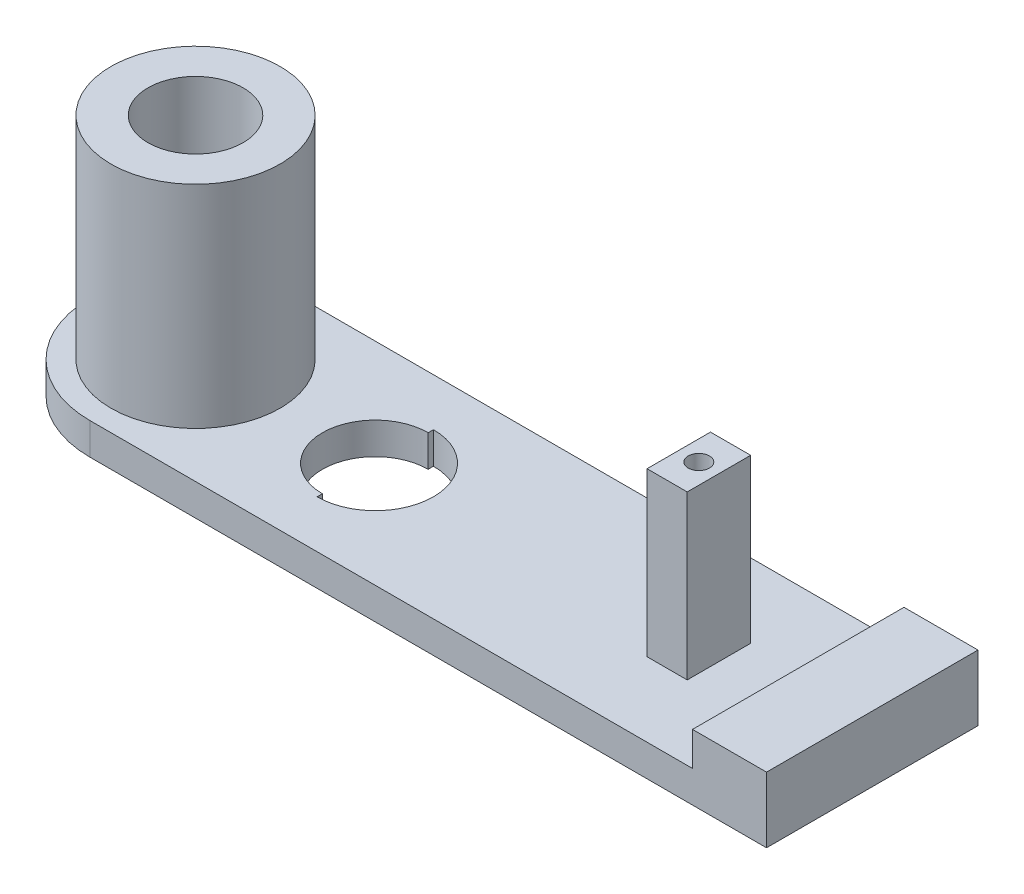
ISO-10303-21;
HEADER;
FILE_DESCRIPTION(('STEP AP214'),'2;1');
FILE_NAME('part.step','',(''),(''),'','','');
FILE_SCHEMA(('AUTOMOTIVE_DESIGN { 1 0 10303 214 1 1 1 1 }'));
ENDSEC;
DATA;
#1=APPLICATION_CONTEXT('core data for automotive mechanical design processes');
#2=APPLICATION_PROTOCOL_DEFINITION('international standard','automotive_design',2000,#1);
#3=PRODUCT_CONTEXT('',#1,'mechanical');
#4=PRODUCT('Part','Part','',(#3));
#5=PRODUCT_RELATED_PRODUCT_CATEGORY('part','',(#4));
#6=PRODUCT_DEFINITION_FORMATION('','',#4);
#7=PRODUCT_DEFINITION_CONTEXT('part definition',#1,'design');
#8=PRODUCT_DEFINITION('design','',#6,#7);
#9=PRODUCT_DEFINITION_SHAPE('','',#8);
#10=(LENGTH_UNIT() NAMED_UNIT(*) SI_UNIT(.MILLI.,.METRE.));
#11=(NAMED_UNIT(*) PLANE_ANGLE_UNIT() SI_UNIT($,.RADIAN.));
#12=(NAMED_UNIT(*) SI_UNIT($,.STERADIAN.) SOLID_ANGLE_UNIT());
#13=UNCERTAINTY_MEASURE_WITH_UNIT(LENGTH_MEASURE(1.E-05),#10,'distance_accuracy_value','');
#14=(GEOMETRIC_REPRESENTATION_CONTEXT(3) GLOBAL_UNCERTAINTY_ASSIGNED_CONTEXT((#13)) GLOBAL_UNIT_ASSIGNED_CONTEXT((#10,
#11,#12)) REPRESENTATION_CONTEXT('',''));
#15=CARTESIAN_POINT('',(0.,0.,0.));
#16=DIRECTION('',(0.,0.,1.));
#17=DIRECTION('',(1.,0.,0.));
#18=AXIS2_PLACEMENT_3D('',#15,#16,#17);
#19=CARTESIAN_POINT('',(-160.,15.,0.));
#20=DIRECTION('',(0.,1.,0.));
#21=DIRECTION('',(0.,0.,1.));
#22=AXIS2_PLACEMENT_3D('',#19,#20,#21);
#23=PLANE('',#22);
#24=CARTESIAN_POINT('',(-75.,15.,0.));
#25=DIRECTION('',(0.,1.,0.));
#26=DIRECTION('',(0.,0.,1.));
#27=AXIS2_PLACEMENT_3D('',#24,#25,#26);
#28=CIRCLE('',#27,27.5);
#29=CARTESIAN_POINT('',(-75.,15.,27.5));
#30=VERTEX_POINT('',#29);
#31=CARTESIAN_POINT('',(-75.,15.,-27.5));
#32=VERTEX_POINT('',#31);
#33=EDGE_CURVE('E54',#30,#32,#28,.T.);
#34=ORIENTED_EDGE('',*,*,#33,.F.);
#35=DIRECTION('',(0.,0.,1.));
#36=VECTOR('',#35,1.);
#37=CARTESIAN_POINT('',(-75.,15.,27.5));
#38=LINE('',#37,#36);
#39=CARTESIAN_POINT('',(-75.,15.,25.));
#40=VERTEX_POINT('',#39);
#41=EDGE_CURVE('E161',#40,#30,#38,.T.);
#42=ORIENTED_EDGE('',*,*,#41,.F.);
#43=CARTESIAN_POINT('',(-75.,15.,0.));
#44=DIRECTION('',(0.,1.,0.));
#45=DIRECTION('',(0.,0.,1.));
#46=AXIS2_PLACEMENT_3D('',#43,#44,#45);
#47=CIRCLE('',#46,25.);
#48=CARTESIAN_POINT('',(-75.,15.,-25.));
#49=VERTEX_POINT('',#48);
#50=EDGE_CURVE('E165',#49,#40,#47,.T.);
#51=ORIENTED_EDGE('',*,*,#50,.F.);
#52=DIRECTION('',(0.,0.,1.));
#53=VECTOR('',#52,1.);
#54=CARTESIAN_POINT('',(-75.,15.,-27.5));
#55=LINE('',#54,#53);
#56=EDGE_CURVE('E176',#32,#49,#55,.T.);
#57=ORIENTED_EDGE('',*,*,#56,.F.);
#58=EDGE_LOOP('',(#34,#42,#51,#57));
#59=FACE_BOUND('',#58,.T.);
#60=DIRECTION('',(-1.,0.,0.));
#61=VECTOR('',#60,1.);
#62=CARTESIAN_POINT('',(68.5,15.,-15.));
#63=LINE('',#62,#61);
#64=CARTESIAN_POINT('',(87.5,15.,-15.));
#65=VERTEX_POINT('',#64);
#66=CARTESIAN_POINT('',(68.5,15.,-15.));
#67=VERTEX_POINT('',#66);
#68=EDGE_CURVE('E213',#65,#67,#63,.T.);
#69=ORIENTED_EDGE('',*,*,#68,.F.);
#70=DIRECTION('',(0.,0.,-1.));
#71=VECTOR('',#70,1.);
#72=CARTESIAN_POINT('',(87.5,15.,-15.));
#73=LINE('',#72,#71);
#74=CARTESIAN_POINT('',(87.5,15.,15.));
#75=VERTEX_POINT('',#74);
#76=EDGE_CURVE('E194',#75,#65,#73,.T.);
#77=ORIENTED_EDGE('',*,*,#76,.F.);
#78=DIRECTION('',(1.,0.,0.));
#79=VECTOR('',#78,1.);
#80=CARTESIAN_POINT('',(68.5,15.,15.));
#81=LINE('',#80,#79);
#82=CARTESIAN_POINT('',(68.5,15.,15.));
#83=VERTEX_POINT('',#82);
#84=EDGE_CURVE('E200',#83,#75,#81,.T.);
#85=ORIENTED_EDGE('',*,*,#84,.F.);
#86=DIRECTION('',(0.,0.,1.));
#87=VECTOR('',#86,1.);
#88=CARTESIAN_POINT('',(68.5,15.,-15.));
#89=LINE('',#88,#87);
#90=EDGE_CURVE('E216',#67,#83,#89,.T.);
#91=ORIENTED_EDGE('',*,*,#90,.F.);
#92=EDGE_LOOP('',(#69,#77,#85,#91));
#93=FACE_BOUND('',#92,.T.);
#94=CARTESIAN_POINT('',(-160.,15.,0.));
#95=DIRECTION('',(0.,1.,0.));
#96=DIRECTION('',(0.,0.,1.));
#97=AXIS2_PLACEMENT_3D('',#94,#95,#96);
#98=CIRCLE('',#97,40.);
#99=CARTESIAN_POINT('',(-160.,15.,40.));
#100=VERTEX_POINT('',#99);
#101=EDGE_CURVE('E270',#100,#100,#98,.T.);
#102=ORIENTED_EDGE('',*,*,#101,.F.);
#103=EDGE_LOOP('',(#102));
#104=FACE_BOUND('',#103,.T.);
#105=DIRECTION('',(1.,0.,0.));
#106=VECTOR('',#105,1.);
#107=CARTESIAN_POINT('',(-160.,15.,50.));
#108=LINE('',#107,#106);
#109=CARTESIAN_POINT('',(-160.,15.,50.));
#110=VERTEX_POINT('',#109);
#111=CARTESIAN_POINT('',(125.,15.,50.));
#112=VERTEX_POINT('',#111);
#113=EDGE_CURVE('E286',#110,#112,#108,.T.);
#114=ORIENTED_EDGE('',*,*,#113,.T.);
#115=DIRECTION('',(0.,0.,1.));
#116=VECTOR('',#115,1.);
#117=CARTESIAN_POINT('',(125.,15.,50.));
#118=LINE('',#117,#116);
#119=CARTESIAN_POINT('',(125.,15.,-50.));
#120=VERTEX_POINT('',#119);
#121=EDGE_CURVE('E235',#120,#112,#118,.T.);
#122=ORIENTED_EDGE('',*,*,#121,.F.);
#123=DIRECTION('',(-1.,0.,0.));
#124=VECTOR('',#123,1.);
#125=CARTESIAN_POINT('',(-160.,15.,-50.));
#126=LINE('',#125,#124);
#127=CARTESIAN_POINT('',(-160.,15.,-50.));
#128=VERTEX_POINT('',#127);
#129=EDGE_CURVE('E279',#120,#128,#126,.T.);
#130=ORIENTED_EDGE('',*,*,#129,.T.);
#131=CARTESIAN_POINT('',(-160.,15.,0.));
#132=DIRECTION('',(0.,1.,0.));
#133=DIRECTION('',(0.,0.,1.));
#134=AXIS2_PLACEMENT_3D('',#131,#132,#133);
#135=CIRCLE('',#134,50.);
#136=EDGE_CURVE('E282',#128,#110,#135,.T.);
#137=ORIENTED_EDGE('',*,*,#136,.T.);
#138=EDGE_LOOP('',(#114,#122,#130,#137));
#139=FACE_BOUND('',#138,.T.);
#140=ADVANCED_FACE('F38',(#59,#93,#104,#139),#23,.T.);
#141=CARTESIAN_POINT('',(-160.,115.,0.));
#142=DIRECTION('',(0.,1.,0.));
#143=DIRECTION('',(0.,0.,1.));
#144=AXIS2_PLACEMENT_3D('',#141,#142,#143);
#145=CYLINDRICAL_SURFACE('',#144,14.);
#146=CARTESIAN_POINT('',(-160.,0.,0.));
#147=DIRECTION('',(0.,1.,0.));
#148=DIRECTION('',(0.,0.,1.));
#149=AXIS2_PLACEMENT_3D('',#146,#147,#148);
#150=CIRCLE('',#149,14.);
#151=CARTESIAN_POINT('',(-160.,0.,14.));
#152=VERTEX_POINT('',#151);
#153=EDGE_CURVE('E266',#152,#152,#150,.T.);
#154=ORIENTED_EDGE('',*,*,#153,.F.);
#155=EDGE_LOOP('',(#154));
#156=FACE_BOUND('',#155,.T.);
#157=CARTESIAN_POINT('',(-160.,65.,0.));
#158=DIRECTION('',(0.,1.,0.));
#159=DIRECTION('',(0.,0.,1.));
#160=AXIS2_PLACEMENT_3D('',#157,#158,#159);
#161=CIRCLE('',#160,14.);
#162=CARTESIAN_POINT('',(-160.,65.,14.));
#163=VERTEX_POINT('',#162);
#164=EDGE_CURVE('E265',#163,#163,#161,.F.);
#165=ORIENTED_EDGE('',*,*,#164,.F.);
#166=EDGE_LOOP('',(#165));
#167=FACE_BOUND('',#166,.T.);
#168=ADVANCED_FACE('F335',(#156,#167),#145,.F.);
#169=CARTESIAN_POINT('',(160.,15.,-50.));
#170=DIRECTION('',(-1.,0.,0.));
#171=DIRECTION('',(0.,0.,1.));
#172=AXIS2_PLACEMENT_3D('',#169,#170,#171);
#173=PLANE('',#172);
#174=DIRECTION('',(0.,0.,-1.));
#175=VECTOR('',#174,1.);
#176=CARTESIAN_POINT('',(160.,0.,-50.));
#177=LINE('',#176,#175);
#178=CARTESIAN_POINT('',(160.,0.,50.));
#179=VERTEX_POINT('',#178);
#180=CARTESIAN_POINT('',(160.,0.,-50.));
#181=VERTEX_POINT('',#180);
#182=EDGE_CURVE('E275',#179,#181,#177,.T.);
#183=ORIENTED_EDGE('',*,*,#182,.T.);
#184=DIRECTION('',(0.,-1.,0.));
#185=VECTOR('',#184,1.);
#186=CARTESIAN_POINT('',(160.,15.,-50.));
#187=LINE('',#186,#185);
#188=CARTESIAN_POINT('',(160.,31.,-50.));
#189=VERTEX_POINT('',#188);
#190=EDGE_CURVE('E312',#189,#181,#187,.T.);
#191=ORIENTED_EDGE('',*,*,#190,.F.);
#192=DIRECTION('',(0.,0.,-1.));
#193=VECTOR('',#192,1.);
#194=CARTESIAN_POINT('',(160.,31.,50.));
#195=LINE('',#194,#193);
#196=CARTESIAN_POINT('',(160.,31.,50.));
#197=VERTEX_POINT('',#196);
#198=EDGE_CURVE('E236',#197,#189,#195,.T.);
#199=ORIENTED_EDGE('',*,*,#198,.F.);
#200=DIRECTION('',(0.,-1.,0.));
#201=VECTOR('',#200,1.);
#202=CARTESIAN_POINT('',(160.,15.,50.));
#203=LINE('',#202,#201);
#204=EDGE_CURVE('E289',#197,#179,#203,.T.);
#205=ORIENTED_EDGE('',*,*,#204,.T.);
#206=EDGE_LOOP('',(#183,#191,#199,#205));
#207=FACE_BOUND('',#206,.T.);
#208=ADVANCED_FACE('F341',(#207),#173,.F.);
#209=CARTESIAN_POINT('',(-160.,15.,-50.));
#210=DIRECTION('',(0.,0.,1.));
#211=DIRECTION('',(1.,0.,0.));
#212=AXIS2_PLACEMENT_3D('',#209,#210,#211);
#213=PLANE('',#212);
#214=DIRECTION('',(-1.,0.,0.));
#215=VECTOR('',#214,1.);
#216=CARTESIAN_POINT('',(-160.,0.,-50.));
#217=LINE('',#216,#215);
#218=CARTESIAN_POINT('',(-160.,0.,-50.));
#219=VERTEX_POINT('',#218);
#220=EDGE_CURVE('E293',#181,#219,#217,.T.);
#221=ORIENTED_EDGE('',*,*,#220,.T.);
#222=DIRECTION('',(0.,-1.,0.));
#223=VECTOR('',#222,1.);
#224=CARTESIAN_POINT('',(-160.,15.,-50.));
#225=LINE('',#224,#223);
#226=EDGE_CURVE('E308',#128,#219,#225,.T.);
#227=ORIENTED_EDGE('',*,*,#226,.F.);
#228=ORIENTED_EDGE('',*,*,#129,.F.);
#229=DIRECTION('',(0.,-1.,0.));
#230=VECTOR('',#229,1.);
#231=CARTESIAN_POINT('',(125.,31.,-50.));
#232=LINE('',#231,#230);
#233=CARTESIAN_POINT('',(125.,31.,-50.));
#234=VERTEX_POINT('',#233);
#235=EDGE_CURVE('E257',#234,#120,#232,.T.);
#236=ORIENTED_EDGE('',*,*,#235,.F.);
#237=DIRECTION('',(-1.,0.,0.));
#238=VECTOR('',#237,1.);
#239=CARTESIAN_POINT('',(160.,31.,-50.));
#240=LINE('',#239,#238);
#241=EDGE_CURVE('E240',#189,#234,#240,.T.);
#242=ORIENTED_EDGE('',*,*,#241,.F.);
#243=ORIENTED_EDGE('',*,*,#190,.T.);
#244=EDGE_LOOP('',(#221,#227,#228,#236,#242,#243));
#245=FACE_BOUND('',#244,.T.);
#246=ADVANCED_FACE('F359',(#245),#213,.F.);
#247=CARTESIAN_POINT('',(-160.,15.,0.));
#248=DIRECTION('',(0.,-1.,0.));
#249=DIRECTION('',(0.,0.,-1.));
#250=AXIS2_PLACEMENT_3D('',#247,#248,#249);
#251=CYLINDRICAL_SURFACE('',#250,50.);
#252=CARTESIAN_POINT('',(-160.,0.,0.));
#253=DIRECTION('',(0.,1.,0.));
#254=DIRECTION('',(0.,0.,1.));
#255=AXIS2_PLACEMENT_3D('',#252,#253,#254);
#256=CIRCLE('',#255,50.);
#257=CARTESIAN_POINT('',(-160.,0.,50.));
#258=VERTEX_POINT('',#257);
#259=EDGE_CURVE('E296',#219,#258,#256,.T.);
#260=ORIENTED_EDGE('',*,*,#259,.T.);
#261=DIRECTION('',(0.,-1.,0.));
#262=VECTOR('',#261,1.);
#263=CARTESIAN_POINT('',(-160.,15.,50.));
#264=LINE('',#263,#262);
#265=EDGE_CURVE('E304',#110,#258,#264,.T.);
#266=ORIENTED_EDGE('',*,*,#265,.F.);
#267=ORIENTED_EDGE('',*,*,#136,.F.);
#268=ORIENTED_EDGE('',*,*,#226,.T.);
#269=EDGE_LOOP('',(#260,#266,#267,#268));
#270=FACE_BOUND('',#269,.T.);
#271=ADVANCED_FACE('F355',(#270),#251,.T.);
#272=CARTESIAN_POINT('',(-160.,15.,50.));
#273=DIRECTION('',(0.,0.,-1.));
#274=DIRECTION('',(-1.,0.,0.));
#275=AXIS2_PLACEMENT_3D('',#272,#273,#274);
#276=PLANE('',#275);
#277=DIRECTION('',(1.,0.,0.));
#278=VECTOR('',#277,1.);
#279=CARTESIAN_POINT('',(-160.,0.,50.));
#280=LINE('',#279,#278);
#281=EDGE_CURVE('E283',#258,#179,#280,.T.);
#282=ORIENTED_EDGE('',*,*,#281,.T.);
#283=ORIENTED_EDGE('',*,*,#204,.F.);
#284=DIRECTION('',(1.,0.,0.));
#285=VECTOR('',#284,1.);
#286=CARTESIAN_POINT('',(160.,31.,50.));
#287=LINE('',#286,#285);
#288=CARTESIAN_POINT('',(125.,31.,50.));
#289=VERTEX_POINT('',#288);
#290=EDGE_CURVE('E246',#289,#197,#287,.T.);
#291=ORIENTED_EDGE('',*,*,#290,.F.);
#292=DIRECTION('',(0.,-1.,0.));
#293=VECTOR('',#292,1.);
#294=CARTESIAN_POINT('',(125.,31.,50.));
#295=LINE('',#294,#293);
#296=EDGE_CURVE('E250',#289,#112,#295,.T.);
#297=ORIENTED_EDGE('',*,*,#296,.T.);
#298=ORIENTED_EDGE('',*,*,#113,.F.);
#299=ORIENTED_EDGE('',*,*,#265,.T.);
#300=EDGE_LOOP('',(#282,#283,#291,#297,#298,#299));
#301=FACE_BOUND('',#300,.T.);
#302=ADVANCED_FACE('F351',(#301),#276,.F.);
#303=CARTESIAN_POINT('',(-160.,0.,0.));
#304=DIRECTION('',(0.,1.,0.));
#305=DIRECTION('',(0.,0.,1.));
#306=AXIS2_PLACEMENT_3D('',#303,#304,#305);
#307=PLANE('',#306);
#308=CARTESIAN_POINT('',(78.,0.,0.));
#309=DIRECTION('',(0.,1.,0.));
#310=DIRECTION('',(0.,0.,1.));
#311=AXIS2_PLACEMENT_3D('',#308,#309,#310);
#312=CIRCLE('',#311,5.);
#313=CARTESIAN_POINT('',(78.,0.,5.));
#314=VERTEX_POINT('',#313);
#315=EDGE_CURVE('E168',#314,#314,#312,.T.);
#316=ORIENTED_EDGE('',*,*,#315,.T.);
#317=EDGE_LOOP('',(#316));
#318=FACE_BOUND('',#317,.T.);
#319=DIRECTION('',(0.,0.,1.));
#320=VECTOR('',#319,1.);
#321=CARTESIAN_POINT('',(-75.,0.,27.5));
#322=LINE('',#321,#320);
#323=CARTESIAN_POINT('',(-75.,0.,25.));
#324=VERTEX_POINT('',#323);
#325=CARTESIAN_POINT('',(-75.,0.,27.5));
#326=VERTEX_POINT('',#325);
#327=EDGE_CURVE('E149',#324,#326,#322,.T.);
#328=ORIENTED_EDGE('',*,*,#327,.T.);
#329=CARTESIAN_POINT('',(-75.,0.,0.));
#330=DIRECTION('',(0.,1.,0.));
#331=DIRECTION('',(0.,0.,1.));
#332=AXIS2_PLACEMENT_3D('',#329,#330,#331);
#333=CIRCLE('',#332,27.5);
#334=CARTESIAN_POINT('',(-75.,0.,-27.5));
#335=VERTEX_POINT('',#334);
#336=EDGE_CURVE('E142',#326,#335,#333,.T.);
#337=ORIENTED_EDGE('',*,*,#336,.T.);
#338=DIRECTION('',(0.,0.,1.));
#339=VECTOR('',#338,1.);
#340=CARTESIAN_POINT('',(-75.,0.,-27.5));
#341=LINE('',#340,#339);
#342=CARTESIAN_POINT('',(-75.,0.,-25.));
#343=VERTEX_POINT('',#342);
#344=EDGE_CURVE('E152',#335,#343,#341,.T.);
#345=ORIENTED_EDGE('',*,*,#344,.T.);
#346=CARTESIAN_POINT('',(-75.,0.,0.));
#347=DIRECTION('',(0.,1.,0.));
#348=DIRECTION('',(0.,0.,1.));
#349=AXIS2_PLACEMENT_3D('',#346,#347,#348);
#350=CIRCLE('',#349,25.);
#351=EDGE_CURVE('E62',#343,#324,#350,.T.);
#352=ORIENTED_EDGE('',*,*,#351,.T.);
#353=EDGE_LOOP('',(#328,#337,#345,#352));
#354=FACE_BOUND('',#353,.T.);
#355=ORIENTED_EDGE('',*,*,#153,.T.);
#356=EDGE_LOOP('',(#355));
#357=FACE_BOUND('',#356,.T.);
#358=ORIENTED_EDGE('',*,*,#182,.F.);
#359=ORIENTED_EDGE('',*,*,#281,.F.);
#360=ORIENTED_EDGE('',*,*,#259,.F.);
#361=ORIENTED_EDGE('',*,*,#220,.F.);
#362=EDGE_LOOP('',(#358,#359,#360,#361));
#363=FACE_BOUND('',#362,.T.);
#364=ADVANCED_FACE('F157',(#318,#354,#357,#363),#307,.F.);
#365=CARTESIAN_POINT('',(-160.,115.,0.));
#366=DIRECTION('',(0.,-1.,0.));
#367=DIRECTION('',(0.,0.,-1.));
#368=AXIS2_PLACEMENT_3D('',#365,#366,#367);
#369=CYLINDRICAL_SURFACE('',#368,40.);
#370=CARTESIAN_POINT('',(-160.,115.,0.));
#371=DIRECTION('',(0.,1.,0.));
#372=DIRECTION('',(0.,0.,1.));
#373=AXIS2_PLACEMENT_3D('',#370,#371,#372);
#374=CIRCLE('',#373,40.);
#375=CARTESIAN_POINT('',(-160.,115.,40.));
#376=VERTEX_POINT('',#375);
#377=EDGE_CURVE('E271',#376,#376,#374,.T.);
#378=ORIENTED_EDGE('',*,*,#377,.F.);
#379=EDGE_LOOP('',(#378));
#380=FACE_BOUND('',#379,.T.);
#381=ORIENTED_EDGE('',*,*,#101,.T.);
#382=EDGE_LOOP('',(#381));
#383=FACE_BOUND('',#382,.T.);
#384=ADVANCED_FACE('F347',(#380,#383),#369,.T.);
#385=CARTESIAN_POINT('',(-160.,115.,0.));
#386=DIRECTION('',(0.,1.,0.));
#387=DIRECTION('',(0.,0.,1.));
#388=AXIS2_PLACEMENT_3D('',#385,#386,#387);
#389=PLANE('',#388);
#390=CARTESIAN_POINT('',(-160.,115.,0.));
#391=DIRECTION('',(0.,1.,0.));
#392=DIRECTION('',(0.,0.,1.));
#393=AXIS2_PLACEMENT_3D('',#390,#391,#392);
#394=CIRCLE('',#393,22.5);
#395=CARTESIAN_POINT('',(-160.,115.,22.5));
#396=VERTEX_POINT('',#395);
#397=EDGE_CURVE('E261',#396,#396,#394,.T.);
#398=ORIENTED_EDGE('',*,*,#397,.F.);
#399=EDGE_LOOP('',(#398));
#400=FACE_BOUND('',#399,.T.);
#401=ORIENTED_EDGE('',*,*,#377,.T.);
#402=EDGE_LOOP('',(#401));
#403=FACE_BOUND('',#402,.T.);
#404=ADVANCED_FACE('F402',(#400,#403),#389,.T.);
#405=CARTESIAN_POINT('',(-160.,65.,0.));
#406=DIRECTION('',(0.,1.,0.));
#407=DIRECTION('',(0.,0.,1.));
#408=AXIS2_PLACEMENT_3D('',#405,#406,#407);
#409=PLANE('',#408);
#410=CARTESIAN_POINT('',(-160.,65.,0.));
#411=DIRECTION('',(0.,1.,0.));
#412=DIRECTION('',(0.,0.,1.));
#413=AXIS2_PLACEMENT_3D('',#410,#411,#412);
#414=CIRCLE('',#413,21.5);
#415=CARTESIAN_POINT('',(-160.,65.,21.5));
#416=VERTEX_POINT('',#415);
#417=EDGE_CURVE('E47',#416,#416,#414,.T.);
#418=ORIENTED_EDGE('',*,*,#417,.T.);
#419=EDGE_LOOP('',(#418));
#420=FACE_BOUND('',#419,.T.);
#421=ORIENTED_EDGE('',*,*,#164,.T.);
#422=EDGE_LOOP('',(#421));
#423=FACE_BOUND('',#422,.T.);
#424=ADVANCED_FACE('F322',(#420,#423),#409,.T.);
#425=CARTESIAN_POINT('',(-160.,65.,0.));
#426=DIRECTION('',(0.,1.,0.));
#427=DIRECTION('',(0.,0.,1.));
#428=AXIS2_PLACEMENT_3D('',#425,#426,#427);
#429=CYLINDRICAL_SURFACE('',#428,22.5);
#430=CARTESIAN_POINT('',(-160.,66.,0.));
#431=DIRECTION('',(0.,1.,0.));
#432=DIRECTION('',(0.,0.,1.));
#433=AXIS2_PLACEMENT_3D('',#430,#431,#432);
#434=CIRCLE('',#433,22.5);
#435=CARTESIAN_POINT('',(-160.,66.,22.5));
#436=VERTEX_POINT('',#435);
#437=EDGE_CURVE('E11',#436,#436,#434,.F.);
#438=ORIENTED_EDGE('',*,*,#437,.T.);
#439=EDGE_LOOP('',(#438));
#440=FACE_BOUND('',#439,.T.);
#441=ORIENTED_EDGE('',*,*,#397,.T.);
#442=EDGE_LOOP('',(#441));
#443=FACE_BOUND('',#442,.T.);
#444=ADVANCED_FACE('F388',(#440,#443),#429,.F.);
#445=CARTESIAN_POINT('',(125.,31.,50.));
#446=DIRECTION('',(1.,0.,0.));
#447=DIRECTION('',(0.,0.,-1.));
#448=AXIS2_PLACEMENT_3D('',#445,#446,#447);
#449=PLANE('',#448);
#450=ORIENTED_EDGE('',*,*,#121,.T.);
#451=ORIENTED_EDGE('',*,*,#296,.F.);
#452=DIRECTION('',(0.,0.,1.));
#453=VECTOR('',#452,1.);
#454=CARTESIAN_POINT('',(125.,31.,50.));
#455=LINE('',#454,#453);
#456=EDGE_CURVE('E243',#234,#289,#455,.T.);
#457=ORIENTED_EDGE('',*,*,#456,.F.);
#458=ORIENTED_EDGE('',*,*,#235,.T.);
#459=EDGE_LOOP('',(#450,#451,#457,#458));
#460=FACE_BOUND('',#459,.T.);
#461=ADVANCED_FACE('F386',(#460),#449,.F.);
#462=CARTESIAN_POINT('',(0.,31.,0.));
#463=DIRECTION('',(0.,1.,0.));
#464=DIRECTION('',(0.,0.,1.));
#465=AXIS2_PLACEMENT_3D('',#462,#463,#464);
#466=PLANE('',#465);
#467=ORIENTED_EDGE('',*,*,#198,.T.);
#468=ORIENTED_EDGE('',*,*,#241,.T.);
#469=ORIENTED_EDGE('',*,*,#456,.T.);
#470=ORIENTED_EDGE('',*,*,#290,.T.);
#471=EDGE_LOOP('',(#467,#468,#469,#470));
#472=FACE_BOUND('',#471,.T.);
#473=ADVANCED_FACE('F378',(#472),#466,.T.);
#474=CARTESIAN_POINT('',(0.,92.,0.));
#475=DIRECTION('',(0.,1.,0.));
#476=DIRECTION('',(0.,0.,1.));
#477=AXIS2_PLACEMENT_3D('',#474,#475,#476);
#478=PLANE('',#477);
#479=DIRECTION('',(0.,0.,-1.));
#480=VECTOR('',#479,1.);
#481=CARTESIAN_POINT('',(87.5,92.,-15.));
#482=LINE('',#481,#480);
#483=CARTESIAN_POINT('',(87.5,92.,15.));
#484=VERTEX_POINT('',#483);
#485=CARTESIAN_POINT('',(87.5,92.,-15.));
#486=VERTEX_POINT('',#485);
#487=EDGE_CURVE('E195',#484,#486,#482,.T.);
#488=ORIENTED_EDGE('',*,*,#487,.T.);
#489=DIRECTION('',(-1.,0.,0.));
#490=VECTOR('',#489,1.);
#491=CARTESIAN_POINT('',(68.5,92.,-15.));
#492=LINE('',#491,#490);
#493=CARTESIAN_POINT('',(68.5,92.,-15.));
#494=VERTEX_POINT('',#493);
#495=EDGE_CURVE('E199',#486,#494,#492,.T.);
#496=ORIENTED_EDGE('',*,*,#495,.T.);
#497=DIRECTION('',(0.,0.,1.));
#498=VECTOR('',#497,1.);
#499=CARTESIAN_POINT('',(68.5,92.,-15.));
#500=LINE('',#499,#498);
#501=CARTESIAN_POINT('',(68.5,92.,15.));
#502=VERTEX_POINT('',#501);
#503=EDGE_CURVE('E203',#494,#502,#500,.T.);
#504=ORIENTED_EDGE('',*,*,#503,.T.);
#505=DIRECTION('',(1.,0.,0.));
#506=VECTOR('',#505,1.);
#507=CARTESIAN_POINT('',(68.5,92.,15.));
#508=LINE('',#507,#506);
#509=EDGE_CURVE('E206',#502,#484,#508,.T.);
#510=ORIENTED_EDGE('',*,*,#509,.T.);
#511=EDGE_LOOP('',(#488,#496,#504,#510));
#512=FACE_BOUND('',#511,.T.);
#513=CARTESIAN_POINT('',(78.,92.,0.));
#514=DIRECTION('',(0.,1.,0.));
#515=DIRECTION('',(0.,0.,1.));
#516=AXIS2_PLACEMENT_3D('',#513,#514,#515);
#517=CIRCLE('',#516,5.);
#518=CARTESIAN_POINT('',(78.,92.,5.));
#519=VERTEX_POINT('',#518);
#520=EDGE_CURVE('E185',#519,#519,#517,.T.);
#521=ORIENTED_EDGE('',*,*,#520,.F.);
#522=EDGE_LOOP('',(#521));
#523=FACE_BOUND('',#522,.T.);
#524=ADVANCED_FACE('F394',(#512,#523),#478,.T.);
#525=CARTESIAN_POINT('',(87.5,92.,-15.));
#526=DIRECTION('',(-1.,0.,0.));
#527=DIRECTION('',(0.,0.,1.));
#528=AXIS2_PLACEMENT_3D('',#525,#526,#527);
#529=PLANE('',#528);
#530=ORIENTED_EDGE('',*,*,#76,.T.);
#531=DIRECTION('',(0.,-1.,0.));
#532=VECTOR('',#531,1.);
#533=CARTESIAN_POINT('',(87.5,92.,-15.));
#534=LINE('',#533,#532);
#535=EDGE_CURVE('E232',#486,#65,#534,.T.);
#536=ORIENTED_EDGE('',*,*,#535,.F.);
#537=ORIENTED_EDGE('',*,*,#487,.F.);
#538=DIRECTION('',(0.,-1.,0.));
#539=VECTOR('',#538,1.);
#540=CARTESIAN_POINT('',(87.5,92.,15.));
#541=LINE('',#540,#539);
#542=EDGE_CURVE('E209',#484,#75,#541,.T.);
#543=ORIENTED_EDGE('',*,*,#542,.T.);
#544=EDGE_LOOP('',(#530,#536,#537,#543));
#545=FACE_BOUND('',#544,.T.);
#546=ADVANCED_FACE('F545',(#545),#529,.F.);
#547=CARTESIAN_POINT('',(68.5,92.,-15.));
#548=DIRECTION('',(0.,0.,1.));
#549=DIRECTION('',(1.,0.,0.));
#550=AXIS2_PLACEMENT_3D('',#547,#548,#549);
#551=PLANE('',#550);
#552=ORIENTED_EDGE('',*,*,#68,.T.);
#553=DIRECTION('',(0.,-1.,0.));
#554=VECTOR('',#553,1.);
#555=CARTESIAN_POINT('',(68.5,92.,-15.));
#556=LINE('',#555,#554);
#557=EDGE_CURVE('E228',#494,#67,#556,.T.);
#558=ORIENTED_EDGE('',*,*,#557,.F.);
#559=ORIENTED_EDGE('',*,*,#495,.F.);
#560=ORIENTED_EDGE('',*,*,#535,.T.);
#561=EDGE_LOOP('',(#552,#558,#559,#560));
#562=FACE_BOUND('',#561,.T.);
#563=ADVANCED_FACE('F536',(#562),#551,.F.);
#564=CARTESIAN_POINT('',(68.5,92.,-15.));
#565=DIRECTION('',(1.,0.,0.));
#566=DIRECTION('',(0.,0.,-1.));
#567=AXIS2_PLACEMENT_3D('',#564,#565,#566);
#568=PLANE('',#567);
#569=ORIENTED_EDGE('',*,*,#90,.T.);
#570=DIRECTION('',(0.,-1.,0.));
#571=VECTOR('',#570,1.);
#572=CARTESIAN_POINT('',(68.5,92.,15.));
#573=LINE('',#572,#571);
#574=EDGE_CURVE('E225',#502,#83,#573,.T.);
#575=ORIENTED_EDGE('',*,*,#574,.F.);
#576=ORIENTED_EDGE('',*,*,#503,.F.);
#577=ORIENTED_EDGE('',*,*,#557,.T.);
#578=EDGE_LOOP('',(#569,#575,#576,#577));
#579=FACE_BOUND('',#578,.T.);
#580=ADVANCED_FACE('F529',(#579),#568,.F.);
#581=CARTESIAN_POINT('',(68.5,92.,15.));
#582=DIRECTION('',(0.,0.,-1.));
#583=DIRECTION('',(-1.,0.,0.));
#584=AXIS2_PLACEMENT_3D('',#581,#582,#583);
#585=PLANE('',#584);
#586=ORIENTED_EDGE('',*,*,#84,.T.);
#587=ORIENTED_EDGE('',*,*,#542,.F.);
#588=ORIENTED_EDGE('',*,*,#509,.F.);
#589=ORIENTED_EDGE('',*,*,#574,.T.);
#590=EDGE_LOOP('',(#586,#587,#588,#589));
#591=FACE_BOUND('',#590,.T.);
#592=ADVANCED_FACE('F474',(#591),#585,.F.);
#593=CARTESIAN_POINT('',(78.,92.,0.));
#594=DIRECTION('',(0.,-1.,0.));
#595=DIRECTION('',(0.,0.,-1.));
#596=AXIS2_PLACEMENT_3D('',#593,#594,#595);
#597=CYLINDRICAL_SURFACE('',#596,5.);
#598=ORIENTED_EDGE('',*,*,#520,.T.);
#599=EDGE_LOOP('',(#598));
#600=FACE_BOUND('',#599,.T.);
#601=ORIENTED_EDGE('',*,*,#315,.F.);
#602=EDGE_LOOP('',(#601));
#603=FACE_BOUND('',#602,.T.);
#604=ADVANCED_FACE('F484',(#600,#603),#597,.F.);
#605=CARTESIAN_POINT('',(-75.,0.,0.));
#606=DIRECTION('',(0.,1.,0.));
#607=DIRECTION('',(0.,0.,1.));
#608=AXIS2_PLACEMENT_3D('',#605,#606,#607);
#609=CYLINDRICAL_SURFACE('',#608,27.5);
#610=ORIENTED_EDGE('',*,*,#33,.T.);
#611=DIRECTION('',(0.,1.,0.));
#612=VECTOR('',#611,1.);
#613=CARTESIAN_POINT('',(-75.,0.,-27.5));
#614=LINE('',#613,#612);
#615=EDGE_CURVE('E138',#335,#32,#614,.T.);
#616=ORIENTED_EDGE('',*,*,#615,.F.);
#617=ORIENTED_EDGE('',*,*,#336,.F.);
#618=DIRECTION('',(0.,1.,0.));
#619=VECTOR('',#618,1.);
#620=CARTESIAN_POINT('',(-75.,0.,27.5));
#621=LINE('',#620,#619);
#622=EDGE_CURVE('E182',#326,#30,#621,.T.);
#623=ORIENTED_EDGE('',*,*,#622,.T.);
#624=EDGE_LOOP('',(#610,#616,#617,#623));
#625=FACE_BOUND('',#624,.T.);
#626=ADVANCED_FACE('F140',(#625),#609,.F.);
#627=CARTESIAN_POINT('',(-75.,0.,27.5));
#628=DIRECTION('',(-1.,0.,0.));
#629=DIRECTION('',(0.,0.,1.));
#630=AXIS2_PLACEMENT_3D('',#627,#628,#629);
#631=PLANE('',#630);
#632=ORIENTED_EDGE('',*,*,#41,.T.);
#633=ORIENTED_EDGE('',*,*,#622,.F.);
#634=ORIENTED_EDGE('',*,*,#327,.F.);
#635=DIRECTION('',(0.,1.,0.));
#636=VECTOR('',#635,1.);
#637=CARTESIAN_POINT('',(-75.,0.,25.));
#638=LINE('',#637,#636);
#639=EDGE_CURVE('E186',#324,#40,#638,.T.);
#640=ORIENTED_EDGE('',*,*,#639,.T.);
#641=EDGE_LOOP('',(#632,#633,#634,#640));
#642=FACE_BOUND('',#641,.T.);
#643=ADVANCED_FACE('F483',(#642),#631,.F.);
#644=CARTESIAN_POINT('',(-75.,0.,0.));
#645=DIRECTION('',(0.,1.,0.));
#646=DIRECTION('',(0.,0.,1.));
#647=AXIS2_PLACEMENT_3D('',#644,#645,#646);
#648=CYLINDRICAL_SURFACE('',#647,25.);
#649=ORIENTED_EDGE('',*,*,#50,.T.);
#650=ORIENTED_EDGE('',*,*,#639,.F.);
#651=ORIENTED_EDGE('',*,*,#351,.F.);
#652=DIRECTION('',(0.,1.,0.));
#653=VECTOR('',#652,1.);
#654=CARTESIAN_POINT('',(-75.,0.,-25.));
#655=LINE('',#654,#653);
#656=EDGE_CURVE('E148',#343,#49,#655,.T.);
#657=ORIENTED_EDGE('',*,*,#656,.T.);
#658=EDGE_LOOP('',(#649,#650,#651,#657));
#659=FACE_BOUND('',#658,.T.);
#660=ADVANCED_FACE('F331',(#659),#648,.F.);
#661=CARTESIAN_POINT('',(-75.,0.,-27.5));
#662=DIRECTION('',(-1.,0.,0.));
#663=DIRECTION('',(0.,0.,1.));
#664=AXIS2_PLACEMENT_3D('',#661,#662,#663);
#665=PLANE('',#664);
#666=ORIENTED_EDGE('',*,*,#56,.T.);
#667=ORIENTED_EDGE('',*,*,#656,.F.);
#668=ORIENTED_EDGE('',*,*,#344,.F.);
#669=ORIENTED_EDGE('',*,*,#615,.T.);
#670=EDGE_LOOP('',(#666,#667,#668,#669));
#671=FACE_BOUND('',#670,.T.);
#672=ADVANCED_FACE('F153',(#671),#665,.F.);
#673=CARTESIAN_POINT('',(-160.,66.,0.));
#674=DIRECTION('',(0.,1.,0.));
#675=DIRECTION('',(0.,0.,1.));
#676=AXIS2_PLACEMENT_3D('',#673,#674,#675);
#677=TOROIDAL_SURFACE('',#676,21.5,1.);
#678=ORIENTED_EDGE('',*,*,#437,.F.);
#679=EDGE_LOOP('',(#678));
#680=FACE_BOUND('',#679,.T.);
#681=ORIENTED_EDGE('',*,*,#417,.F.);
#682=EDGE_LOOP('',(#681));
#683=FACE_BOUND('',#682,.T.);
#684=ADVANCED_FACE('F40',(#680,#683),#677,.F.);
#685=CLOSED_SHELL('',(#140,#168,#208,#246,#271,#302,#364,#384,#404,#424,#444,#461,#473,#524,
#546,#563,#580,#592,#604,#626,#643,#660,#672,#684));
#686=MANIFOLD_SOLID_BREP('B2',#685);
#687=ADVANCED_BREP_SHAPE_REPRESENTATION('',(#18,#686),#14);
#688=SHAPE_DEFINITION_REPRESENTATION(#9,#687);
ENDSEC;
END-ISO-10303-21;
